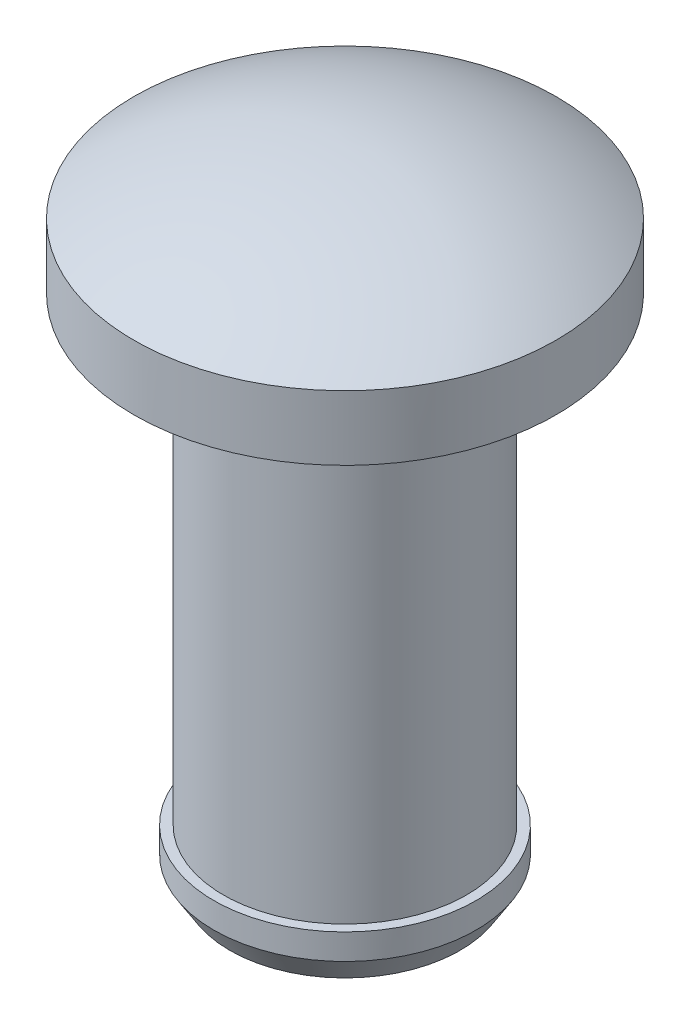
ISO-10303-21;
HEADER;
FILE_DESCRIPTION(('STEP AP214'),'2;1');
FILE_NAME('part.step','',(''),(''),'','','');
FILE_SCHEMA(('AUTOMOTIVE_DESIGN { 1 0 10303 214 1 1 1 1 }'));
ENDSEC;
DATA;
#1=APPLICATION_CONTEXT('core data for automotive mechanical design processes');
#2=APPLICATION_PROTOCOL_DEFINITION('international standard','automotive_design',2000,#1);
#3=PRODUCT_CONTEXT('',#1,'mechanical');
#4=PRODUCT('Part','Part','',(#3));
#5=PRODUCT_RELATED_PRODUCT_CATEGORY('part','',(#4));
#6=PRODUCT_DEFINITION_FORMATION('','',#4);
#7=PRODUCT_DEFINITION_CONTEXT('part definition',#1,'design');
#8=PRODUCT_DEFINITION('design','',#6,#7);
#9=PRODUCT_DEFINITION_SHAPE('','',#8);
#10=(LENGTH_UNIT() NAMED_UNIT(*) SI_UNIT(.MILLI.,.METRE.));
#11=(NAMED_UNIT(*) PLANE_ANGLE_UNIT() SI_UNIT($,.RADIAN.));
#12=(NAMED_UNIT(*) SI_UNIT($,.STERADIAN.) SOLID_ANGLE_UNIT());
#13=UNCERTAINTY_MEASURE_WITH_UNIT(LENGTH_MEASURE(1.E-05),#10,'distance_accuracy_value','');
#14=(GEOMETRIC_REPRESENTATION_CONTEXT(3) GLOBAL_UNCERTAINTY_ASSIGNED_CONTEXT((#13)) GLOBAL_UNIT_ASSIGNED_CONTEXT((#10,
#11,#12)) REPRESENTATION_CONTEXT('',''));
#15=CARTESIAN_POINT('',(0.,0.,0.));
#16=DIRECTION('',(0.,0.,1.));
#17=DIRECTION('',(1.,0.,0.));
#18=AXIS2_PLACEMENT_3D('',#15,#16,#17);
#19=CARTESIAN_POINT('',(-0.9108,0.,0.9108));
#20=DIRECTION('',(0.,-1.,0.));
#21=DIRECTION('',(0.,0.,-1.));
#22=AXIS2_PLACEMENT_3D('',#19,#20,#21);
#23=PLANE('',#22);
#24=CARTESIAN_POINT('',(0.,0.,0.));
#25=DIRECTION('',(0.,1.,0.));
#26=DIRECTION('',(0.,0.,1.));
#27=AXIS2_PLACEMENT_3D('',#24,#25,#26);
#28=CIRCLE('',#27,0.9);
#29=CARTESIAN_POINT('',(0.,0.,0.9));
#30=VERTEX_POINT('',#29);
#31=EDGE_CURVE('E21',#30,#30,#28,.F.);
#32=ORIENTED_EDGE('',*,*,#31,.T.);
#33=EDGE_LOOP('',(#32));
#34=FACE_BOUND('',#33,.T.);
#35=ADVANCED_FACE('F17',(#34),#23,.T.);
#36=CARTESIAN_POINT('',(0.,0.,0.));
#37=DIRECTION('',(0.,1.,0.));
#38=DIRECTION('',(0.,0.,1.));
#39=AXIS2_PLACEMENT_3D('',#36,#37,#38);
#40=CONICAL_SURFACE('',#39,0.9,0.558599315343562);
#41=ORIENTED_EDGE('',*,*,#31,.F.);
#42=EDGE_LOOP('',(#41));
#43=FACE_BOUND('',#42,.T.);
#44=CARTESIAN_POINT('',(0.,0.2,0.));
#45=DIRECTION('',(0.,-1.,0.));
#46=DIRECTION('',(0.,0.,-1.));
#47=AXIS2_PLACEMENT_3D('',#44,#45,#46);
#48=CIRCLE('',#47,1.025);
#49=CARTESIAN_POINT('',(0.,0.2,-1.025));
#50=VERTEX_POINT('',#49);
#51=EDGE_CURVE('E55',#50,#50,#48,.T.);
#52=ORIENTED_EDGE('',*,*,#51,.T.);
#53=EDGE_LOOP('',(#52));
#54=FACE_BOUND('',#53,.T.);
#55=ADVANCED_FACE('F72',(#43,#54),#40,.T.);
#56=CARTESIAN_POINT('',(0.,0.4,0.));
#57=DIRECTION('',(0.,-1.,0.));
#58=DIRECTION('',(0.,0.,-1.));
#59=AXIS2_PLACEMENT_3D('',#56,#57,#58);
#60=CYLINDRICAL_SURFACE('',#59,1.025);
#61=CARTESIAN_POINT('',(0.,0.4,0.));
#62=DIRECTION('',(0.,-1.,0.));
#63=DIRECTION('',(0.,0.,-1.));
#64=AXIS2_PLACEMENT_3D('',#61,#62,#63);
#65=CIRCLE('',#64,1.025);
#66=CARTESIAN_POINT('',(0.,0.4,-1.025));
#67=VERTEX_POINT('',#66);
#68=EDGE_CURVE('E58',#67,#67,#65,.F.);
#69=ORIENTED_EDGE('',*,*,#68,.F.);
#70=EDGE_LOOP('',(#69));
#71=FACE_BOUND('',#70,.T.);
#72=ORIENTED_EDGE('',*,*,#51,.F.);
#73=EDGE_LOOP('',(#72));
#74=FACE_BOUND('',#73,.T.);
#75=ADVANCED_FACE('F74',(#71,#74),#60,.T.);
#76=CARTESIAN_POINT('',(-1.0373,0.4,-1.0373));
#77=DIRECTION('',(0.,1.,0.));
#78=DIRECTION('',(0.,0.,1.));
#79=AXIS2_PLACEMENT_3D('',#76,#77,#78);
#80=PLANE('',#79);
#81=CARTESIAN_POINT('',(0.,0.4,0.));
#82=DIRECTION('',(0.,-1.,0.));
#83=DIRECTION('',(0.,0.,-1.));
#84=AXIS2_PLACEMENT_3D('',#81,#82,#83);
#85=CIRCLE('',#84,0.95);
#86=CARTESIAN_POINT('',(0.,0.4,-0.95));
#87=VERTEX_POINT('',#86);
#88=EDGE_CURVE('E52',#87,#87,#85,.T.);
#89=ORIENTED_EDGE('',*,*,#88,.T.);
#90=EDGE_LOOP('',(#89));
#91=FACE_BOUND('',#90,.T.);
#92=ORIENTED_EDGE('',*,*,#68,.T.);
#93=EDGE_LOOP('',(#92));
#94=FACE_BOUND('',#93,.T.);
#95=ADVANCED_FACE('F81',(#91,#94),#80,.T.);
#96=CARTESIAN_POINT('',(0.,4.,0.));
#97=DIRECTION('',(0.,-1.,0.));
#98=DIRECTION('',(0.,0.,-1.));
#99=AXIS2_PLACEMENT_3D('',#96,#97,#98);
#100=CYLINDRICAL_SURFACE('',#99,0.95);
#101=CARTESIAN_POINT('',(0.,4.,0.));
#102=DIRECTION('',(0.,-1.,0.));
#103=DIRECTION('',(0.,0.,-1.));
#104=AXIS2_PLACEMENT_3D('',#101,#102,#103);
#105=CIRCLE('',#104,0.95);
#106=CARTESIAN_POINT('',(0.,4.,-0.95));
#107=VERTEX_POINT('',#106);
#108=EDGE_CURVE('E46',#107,#107,#105,.F.);
#109=ORIENTED_EDGE('',*,*,#108,.F.);
#110=EDGE_LOOP('',(#109));
#111=FACE_BOUND('',#110,.T.);
#112=ORIENTED_EDGE('',*,*,#88,.F.);
#113=EDGE_LOOP('',(#112));
#114=FACE_BOUND('',#113,.T.);
#115=ADVANCED_FACE('F87',(#111,#114),#100,.T.);
#116=CARTESIAN_POINT('',(-1.6698,4.,1.6698));
#117=DIRECTION('',(0.,-1.,0.));
#118=DIRECTION('',(0.,0.,-1.));
#119=AXIS2_PLACEMENT_3D('',#116,#117,#118);
#120=PLANE('',#119);
#121=ORIENTED_EDGE('',*,*,#108,.T.);
#122=EDGE_LOOP('',(#121));
#123=FACE_BOUND('',#122,.T.);
#124=CARTESIAN_POINT('',(0.,4.,0.));
#125=DIRECTION('',(0.,-1.,0.));
#126=DIRECTION('',(0.,0.,-1.));
#127=AXIS2_PLACEMENT_3D('',#124,#125,#126);
#128=CIRCLE('',#127,1.65);
#129=CARTESIAN_POINT('',(0.,4.,-1.65));
#130=VERTEX_POINT('',#129);
#131=EDGE_CURVE('E26',#130,#130,#128,.T.);
#132=ORIENTED_EDGE('',*,*,#131,.T.);
#133=EDGE_LOOP('',(#132));
#134=FACE_BOUND('',#133,.T.);
#135=ADVANCED_FACE('F19',(#123,#134),#120,.T.);
#136=CARTESIAN_POINT('',(0.,4.505493963,0.));
#137=DIRECTION('',(0.,-1.,0.));
#138=DIRECTION('',(0.,0.,-1.));
#139=AXIS2_PLACEMENT_3D('',#136,#137,#138);
#140=CYLINDRICAL_SURFACE('',#139,1.65);
#141=CARTESIAN_POINT('',(0.,4.50549397955692,0.));
#142=DIRECTION('',(0.,-1.,0.));
#143=DIRECTION('',(1.,0.,0.));
#144=AXIS2_PLACEMENT_3D('',#141,#142,#143);
#145=CIRCLE('',#144,1.64999997527396);
#146=CARTESIAN_POINT('',(1.64999997527396,4.50549397955692,0.));
#147=VERTEX_POINT('',#146);
#148=EDGE_CURVE('E11',#147,#147,#145,.T.);
#149=ORIENTED_EDGE('',*,*,#148,.T.);
#150=EDGE_LOOP('',(#149));
#151=FACE_BOUND('',#150,.T.);
#152=ORIENTED_EDGE('',*,*,#131,.F.);
#153=EDGE_LOOP('',(#152));
#154=FACE_BOUND('',#153,.T.);
#155=ADVANCED_FACE('F35',(#151,#154),#140,.T.);
#156=CARTESIAN_POINT('',(0.,2.,0.));
#157=DIRECTION('',(0.,-1.,0.));
#158=DIRECTION('',(-1.,0.,0.));
#159=AXIS2_PLACEMENT_3D('',#156,#157,#158);
#160=SPHERICAL_SURFACE('',#159,3.);
#161=CARTESIAN_POINT('',(0.,5.,0.));
#162=VERTEX_POINT('',#161);
#163=VERTEX_LOOP('',#162);
#164=FACE_BOUND('',#163,.T.);
#165=ORIENTED_EDGE('',*,*,#148,.F.);
#166=EDGE_LOOP('',(#165));
#167=FACE_BOUND('',#166,.T.);
#168=ADVANCED_FACE('F32',(#164,#167),#160,.T.);
#169=CLOSED_SHELL('',(#35,#55,#75,#95,#115,#135,#155,#168));
#170=MANIFOLD_SOLID_BREP('B1',#169);
#171=ADVANCED_BREP_SHAPE_REPRESENTATION('',(#18,#170),#14);
#172=SHAPE_DEFINITION_REPRESENTATION(#9,#171);
ENDSEC;
END-ISO-10303-21;
